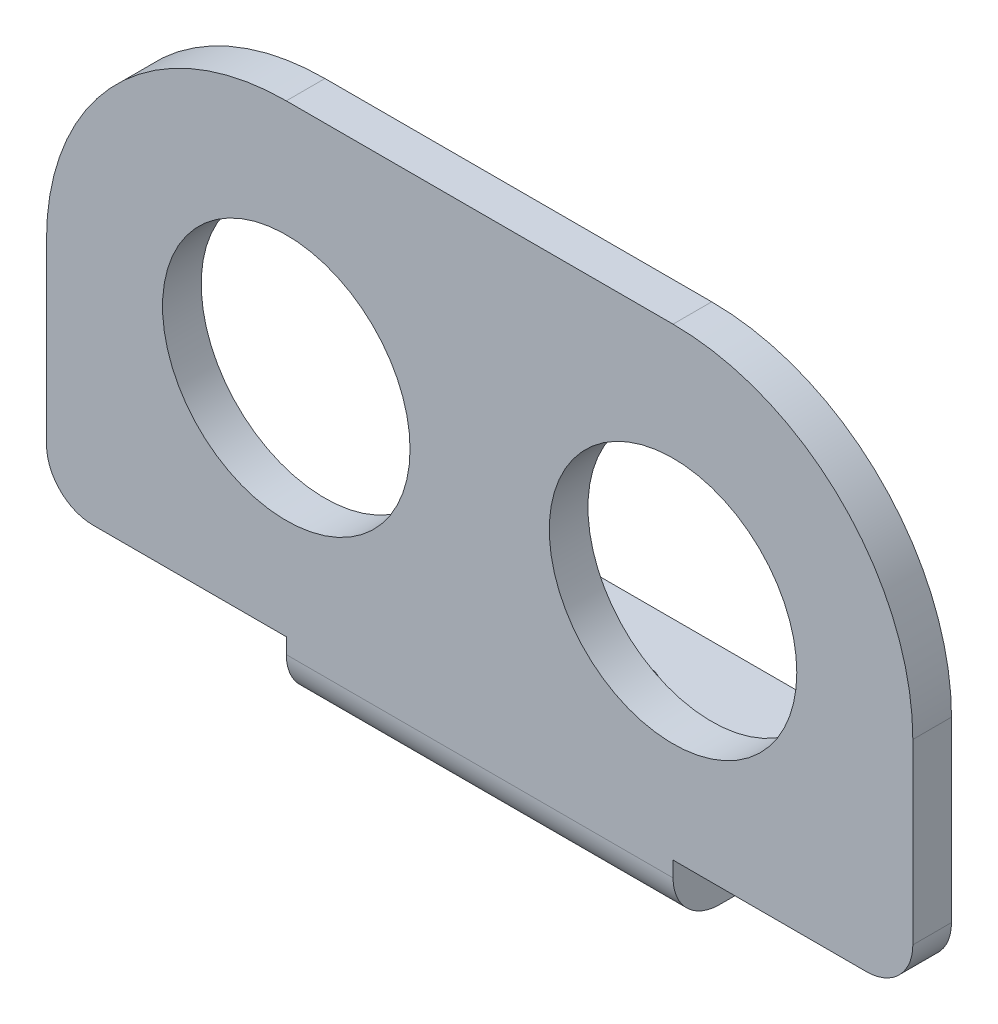
ISO-10303-21;
HEADER;
FILE_DESCRIPTION(('STEP AP214'),'2;1');
FILE_NAME('part.step','',(''),(''),'','','');
FILE_SCHEMA(('AUTOMOTIVE_DESIGN { 1 0 10303 214 1 1 1 1 }'));
ENDSEC;
DATA;
#1=APPLICATION_CONTEXT('core data for automotive mechanical design processes');
#2=APPLICATION_PROTOCOL_DEFINITION('international standard','automotive_design',2000,#1);
#3=PRODUCT_CONTEXT('',#1,'mechanical');
#4=PRODUCT('Part','Part','',(#3));
#5=PRODUCT_RELATED_PRODUCT_CATEGORY('part','',(#4));
#6=PRODUCT_DEFINITION_FORMATION('','',#4);
#7=PRODUCT_DEFINITION_CONTEXT('part definition',#1,'design');
#8=PRODUCT_DEFINITION('design','',#6,#7);
#9=PRODUCT_DEFINITION_SHAPE('','',#8);
#10=(LENGTH_UNIT() NAMED_UNIT(*) SI_UNIT(.MILLI.,.METRE.));
#11=(NAMED_UNIT(*) PLANE_ANGLE_UNIT() SI_UNIT($,.RADIAN.));
#12=(NAMED_UNIT(*) SI_UNIT($,.STERADIAN.) SOLID_ANGLE_UNIT());
#13=UNCERTAINTY_MEASURE_WITH_UNIT(LENGTH_MEASURE(1.E-05),#10,'distance_accuracy_value','');
#14=(GEOMETRIC_REPRESENTATION_CONTEXT(3) GLOBAL_UNCERTAINTY_ASSIGNED_CONTEXT((#13)) GLOBAL_UNIT_ASSIGNED_CONTEXT((#10,
#11,#12)) REPRESENTATION_CONTEXT('',''));
#15=CARTESIAN_POINT('',(0.,0.,0.));
#16=DIRECTION('',(0.,0.,1.));
#17=DIRECTION('',(1.,0.,0.));
#18=AXIS2_PLACEMENT_3D('',#15,#16,#17);
#19=CARTESIAN_POINT('',(12.5,-0.5,2.5));
#20=DIRECTION('',(0.,0.,-1.));
#21=DIRECTION('',(-1.,0.,0.));
#22=AXIS2_PLACEMENT_3D('',#19,#20,#21);
#23=PLANE('',#22);
#24=DIRECTION('',(0.,-1.,0.));
#25=VECTOR('',#24,1.);
#26=CARTESIAN_POINT('',(-12.5,-15.,2.5));
#27=LINE('',#26,#25);
#28=CARTESIAN_POINT('',(-12.5,-15.,2.5));
#29=VERTEX_POINT('',#28);
#30=CARTESIAN_POINT('',(-12.5,-16.,2.5));
#31=VERTEX_POINT('',#30);
#32=EDGE_CURVE('E217',#29,#31,#27,.T.);
#33=ORIENTED_EDGE('',*,*,#32,.T.);
#34=DIRECTION('',(1.,0.,0.));
#35=VECTOR('',#34,1.);
#36=CARTESIAN_POINT('',(12.5,-16.,2.5));
#37=LINE('',#36,#35);
#38=CARTESIAN_POINT('',(12.5,-16.,2.5));
#39=VERTEX_POINT('',#38);
#40=EDGE_CURVE('E295',#31,#39,#37,.T.);
#41=ORIENTED_EDGE('',*,*,#40,.T.);
#42=DIRECTION('',(0.,1.,0.));
#43=VECTOR('',#42,1.);
#44=CARTESIAN_POINT('',(12.5,-15.,2.5));
#45=LINE('',#44,#43);
#46=CARTESIAN_POINT('',(12.5,-15.,2.5));
#47=VERTEX_POINT('',#46);
#48=EDGE_CURVE('E220',#39,#47,#45,.T.);
#49=ORIENTED_EDGE('',*,*,#48,.T.);
#50=DIRECTION('',(1.,0.,0.));
#51=VECTOR('',#50,1.);
#52=CARTESIAN_POINT('',(12.5,-15.,2.5));
#53=LINE('',#52,#51);
#54=CARTESIAN_POINT('',(25.,-15.,2.5));
#55=VERTEX_POINT('',#54);
#56=EDGE_CURVE('E173',#47,#55,#53,.T.);
#57=ORIENTED_EDGE('',*,*,#56,.T.);
#58=CARTESIAN_POINT('',(25.,-12.,2.5));
#59=DIRECTION('',(0.,0.,-1.));
#60=DIRECTION('',(-1.,0.,0.));
#61=AXIS2_PLACEMENT_3D('',#58,#59,#60);
#62=CIRCLE('',#61,3.);
#63=CARTESIAN_POINT('',(28.,-12.,2.5));
#64=VERTEX_POINT('',#63);
#65=EDGE_CURVE('E267',#55,#64,#62,.F.);
#66=ORIENTED_EDGE('',*,*,#65,.T.);
#67=DIRECTION('',(0.,1.,0.));
#68=VECTOR('',#67,1.);
#69=CARTESIAN_POINT('',(28.,-0.5,2.5));
#70=LINE('',#69,#68);
#71=CARTESIAN_POINT('',(28.,-0.5,2.5));
#72=VERTEX_POINT('',#71);
#73=EDGE_CURVE('E204',#64,#72,#70,.T.);
#74=ORIENTED_EDGE('',*,*,#73,.T.);
#75=CARTESIAN_POINT('',(12.5,-0.5,2.5));
#76=DIRECTION('',(0.,0.,1.));
#77=DIRECTION('',(-1.,0.,0.));
#78=AXIS2_PLACEMENT_3D('',#75,#76,#77);
#79=CIRCLE('',#78,15.5);
#80=CARTESIAN_POINT('',(12.5,15.,2.5));
#81=VERTEX_POINT('',#80);
#82=EDGE_CURVE('E206',#72,#81,#79,.T.);
#83=ORIENTED_EDGE('',*,*,#82,.T.);
#84=DIRECTION('',(-1.,0.,0.));
#85=VECTOR('',#84,1.);
#86=CARTESIAN_POINT('',(12.5,15.,2.5));
#87=LINE('',#86,#85);
#88=CARTESIAN_POINT('',(-12.5,15.,2.5));
#89=VERTEX_POINT('',#88);
#90=EDGE_CURVE('E208',#81,#89,#87,.T.);
#91=ORIENTED_EDGE('',*,*,#90,.T.);
#92=CARTESIAN_POINT('',(-12.5,-0.5,2.5));
#93=DIRECTION('',(0.,0.,1.));
#94=DIRECTION('',(1.,0.,0.));
#95=AXIS2_PLACEMENT_3D('',#92,#93,#94);
#96=CIRCLE('',#95,15.5);
#97=CARTESIAN_POINT('',(-28.,-0.499999999999998,2.5));
#98=VERTEX_POINT('',#97);
#99=EDGE_CURVE('E210',#89,#98,#96,.T.);
#100=ORIENTED_EDGE('',*,*,#99,.T.);
#101=DIRECTION('',(0.,-1.,0.));
#102=VECTOR('',#101,1.);
#103=CARTESIAN_POINT('',(-28.,-15.,2.5));
#104=LINE('',#103,#102);
#105=CARTESIAN_POINT('',(-28.,-12.,2.5));
#106=VERTEX_POINT('',#105);
#107=EDGE_CURVE('E212',#98,#106,#104,.T.);
#108=ORIENTED_EDGE('',*,*,#107,.T.);
#109=CARTESIAN_POINT('',(-25.,-12.,2.5));
#110=DIRECTION('',(0.,0.,-1.));
#111=DIRECTION('',(-1.,0.,0.));
#112=AXIS2_PLACEMENT_3D('',#109,#110,#111);
#113=CIRCLE('',#112,3.);
#114=CARTESIAN_POINT('',(-25.,-15.,2.5));
#115=VERTEX_POINT('',#114);
#116=EDGE_CURVE('E269',#106,#115,#113,.F.);
#117=ORIENTED_EDGE('',*,*,#116,.T.);
#118=DIRECTION('',(1.,0.,0.));
#119=VECTOR('',#118,1.);
#120=CARTESIAN_POINT('',(-28.,-15.,2.5));
#121=LINE('',#120,#119);
#122=EDGE_CURVE('E215',#115,#29,#121,.T.);
#123=ORIENTED_EDGE('',*,*,#122,.T.);
#124=EDGE_LOOP('',(#33,#41,#49,#57,#66,#74,#83,#91,#100,#108,#117,#123));
#125=FACE_BOUND('',#124,.T.);
#126=CARTESIAN_POINT('',(12.5,-0.5,2.5));
#127=DIRECTION('',(0.,0.,1.));
#128=DIRECTION('',(1.,0.,0.));
#129=AXIS2_PLACEMENT_3D('',#126,#127,#128);
#130=CIRCLE('',#129,8.);
#131=CARTESIAN_POINT('',(20.5,-0.5,2.5));
#132=VERTEX_POINT('',#131);
#133=EDGE_CURVE('E197',#132,#132,#130,.T.);
#134=ORIENTED_EDGE('',*,*,#133,.F.);
#135=EDGE_LOOP('',(#134));
#136=FACE_BOUND('',#135,.T.);
#137=CARTESIAN_POINT('',(-12.5,-0.5,2.5));
#138=DIRECTION('',(0.,0.,1.));
#139=DIRECTION('',(1.,0.,0.));
#140=AXIS2_PLACEMENT_3D('',#137,#138,#139);
#141=CIRCLE('',#140,8.);
#142=CARTESIAN_POINT('',(-4.5,-0.5,2.5));
#143=VERTEX_POINT('',#142);
#144=EDGE_CURVE('E191',#143,#143,#141,.T.);
#145=ORIENTED_EDGE('',*,*,#144,.F.);
#146=EDGE_LOOP('',(#145));
#147=FACE_BOUND('',#146,.T.);
#148=ADVANCED_FACE('F34',(#125,#136,#147),#23,.F.);
#149=CARTESIAN_POINT('',(12.5,-0.5,0.));
#150=DIRECTION('',(0.,0.,-1.));
#151=DIRECTION('',(-1.,0.,0.));
#152=AXIS2_PLACEMENT_3D('',#149,#150,#151);
#153=PLANE('',#152);
#154=DIRECTION('',(1.,0.,0.));
#155=VECTOR('',#154,1.);
#156=CARTESIAN_POINT('',(12.5,-16.,0.));
#157=LINE('',#156,#155);
#158=CARTESIAN_POINT('',(-12.5,-16.,0.));
#159=VERTEX_POINT('',#158);
#160=CARTESIAN_POINT('',(12.5,-16.,0.));
#161=VERTEX_POINT('',#160);
#162=EDGE_CURVE('E169',#159,#161,#157,.T.);
#163=ORIENTED_EDGE('',*,*,#162,.F.);
#164=DIRECTION('',(0.,-1.,0.));
#165=VECTOR('',#164,1.);
#166=CARTESIAN_POINT('',(-12.5,-15.,0.));
#167=LINE('',#166,#165);
#168=CARTESIAN_POINT('',(-12.5,-15.,0.));
#169=VERTEX_POINT('',#168);
#170=EDGE_CURVE('E174',#169,#159,#167,.T.);
#171=ORIENTED_EDGE('',*,*,#170,.F.);
#172=DIRECTION('',(1.,0.,0.));
#173=VECTOR('',#172,1.);
#174=CARTESIAN_POINT('',(-28.,-15.,0.));
#175=LINE('',#174,#173);
#176=CARTESIAN_POINT('',(-25.,-15.,0.));
#177=VERTEX_POINT('',#176);
#178=EDGE_CURVE('E235',#177,#169,#175,.T.);
#179=ORIENTED_EDGE('',*,*,#178,.F.);
#180=CARTESIAN_POINT('',(-25.,-12.,0.));
#181=DIRECTION('',(0.,0.,-1.));
#182=DIRECTION('',(-1.,0.,0.));
#183=AXIS2_PLACEMENT_3D('',#180,#181,#182);
#184=CIRCLE('',#183,3.);
#185=CARTESIAN_POINT('',(-28.,-12.,0.));
#186=VERTEX_POINT('',#185);
#187=EDGE_CURVE('E263',#177,#186,#184,.T.);
#188=ORIENTED_EDGE('',*,*,#187,.T.);
#189=DIRECTION('',(0.,-1.,0.));
#190=VECTOR('',#189,1.);
#191=CARTESIAN_POINT('',(-28.,-15.,0.));
#192=LINE('',#191,#190);
#193=CARTESIAN_POINT('',(-28.,-0.499999999999998,0.));
#194=VERTEX_POINT('',#193);
#195=EDGE_CURVE('E232',#194,#186,#192,.T.);
#196=ORIENTED_EDGE('',*,*,#195,.F.);
#197=CARTESIAN_POINT('',(-12.5,-0.5,0.));
#198=DIRECTION('',(0.,0.,1.));
#199=DIRECTION('',(1.,0.,0.));
#200=AXIS2_PLACEMENT_3D('',#197,#198,#199);
#201=CIRCLE('',#200,15.5);
#202=CARTESIAN_POINT('',(-12.5,15.,0.));
#203=VERTEX_POINT('',#202);
#204=EDGE_CURVE('E230',#203,#194,#201,.T.);
#205=ORIENTED_EDGE('',*,*,#204,.F.);
#206=DIRECTION('',(-1.,0.,0.));
#207=VECTOR('',#206,1.);
#208=CARTESIAN_POINT('',(12.5,15.,0.));
#209=LINE('',#208,#207);
#210=CARTESIAN_POINT('',(12.5,15.,0.));
#211=VERTEX_POINT('',#210);
#212=EDGE_CURVE('E228',#211,#203,#209,.T.);
#213=ORIENTED_EDGE('',*,*,#212,.F.);
#214=CARTESIAN_POINT('',(12.5,-0.5,0.));
#215=DIRECTION('',(0.,0.,1.));
#216=DIRECTION('',(-1.,0.,0.));
#217=AXIS2_PLACEMENT_3D('',#214,#215,#216);
#218=CIRCLE('',#217,15.5);
#219=CARTESIAN_POINT('',(28.,-0.5,0.));
#220=VERTEX_POINT('',#219);
#221=EDGE_CURVE('E226',#220,#211,#218,.T.);
#222=ORIENTED_EDGE('',*,*,#221,.F.);
#223=DIRECTION('',(0.,1.,0.));
#224=VECTOR('',#223,1.);
#225=CARTESIAN_POINT('',(28.,-0.5,0.));
#226=LINE('',#225,#224);
#227=CARTESIAN_POINT('',(28.,-12.,0.));
#228=VERTEX_POINT('',#227);
#229=EDGE_CURVE('E224',#228,#220,#226,.T.);
#230=ORIENTED_EDGE('',*,*,#229,.F.);
#231=CARTESIAN_POINT('',(25.,-12.,0.));
#232=DIRECTION('',(0.,0.,-1.));
#233=DIRECTION('',(-1.,0.,0.));
#234=AXIS2_PLACEMENT_3D('',#231,#232,#233);
#235=CIRCLE('',#234,3.);
#236=CARTESIAN_POINT('',(25.,-15.,0.));
#237=VERTEX_POINT('',#236);
#238=EDGE_CURVE('E261',#228,#237,#235,.T.);
#239=ORIENTED_EDGE('',*,*,#238,.T.);
#240=DIRECTION('',(1.,0.,0.));
#241=VECTOR('',#240,1.);
#242=CARTESIAN_POINT('',(12.5,-15.,0.));
#243=LINE('',#242,#241);
#244=CARTESIAN_POINT('',(12.5,-15.,0.));
#245=VERTEX_POINT('',#244);
#246=EDGE_CURVE('E172',#245,#237,#243,.T.);
#247=ORIENTED_EDGE('',*,*,#246,.F.);
#248=DIRECTION('',(0.,1.,0.));
#249=VECTOR('',#248,1.);
#250=CARTESIAN_POINT('',(12.5,-15.,0.));
#251=LINE('',#250,#249);
#252=EDGE_CURVE('E153',#161,#245,#251,.T.);
#253=ORIENTED_EDGE('',*,*,#252,.F.);
#254=EDGE_LOOP('',(#163,#171,#179,#188,#196,#205,#213,#222,#230,#239,#247,#253));
#255=FACE_BOUND('',#254,.T.);
#256=CARTESIAN_POINT('',(12.5,-0.5,0.));
#257=DIRECTION('',(0.,0.,1.));
#258=DIRECTION('',(1.,0.,0.));
#259=AXIS2_PLACEMENT_3D('',#256,#257,#258);
#260=CIRCLE('',#259,8.);
#261=CARTESIAN_POINT('',(20.5,-0.5,0.));
#262=VERTEX_POINT('',#261);
#263=EDGE_CURVE('E194',#262,#262,#260,.T.);
#264=ORIENTED_EDGE('',*,*,#263,.T.);
#265=EDGE_LOOP('',(#264));
#266=FACE_BOUND('',#265,.T.);
#267=CARTESIAN_POINT('',(-12.5,-0.5,0.));
#268=DIRECTION('',(0.,0.,1.));
#269=DIRECTION('',(1.,0.,0.));
#270=AXIS2_PLACEMENT_3D('',#267,#268,#269);
#271=CIRCLE('',#270,8.);
#272=CARTESIAN_POINT('',(-4.5,-0.5,0.));
#273=VERTEX_POINT('',#272);
#274=EDGE_CURVE('E190',#273,#273,#271,.T.);
#275=ORIENTED_EDGE('',*,*,#274,.T.);
#276=EDGE_LOOP('',(#275));
#277=FACE_BOUND('',#276,.T.);
#278=ADVANCED_FACE('F166',(#255,#266,#277),#153,.T.);
#279=CARTESIAN_POINT('',(12.5,-15.,2.5));
#280=DIRECTION('',(0.,1.,0.));
#281=DIRECTION('',(-1.,0.,0.));
#282=AXIS2_PLACEMENT_3D('',#279,#280,#281);
#283=PLANE('',#282);
#284=ORIENTED_EDGE('',*,*,#246,.T.);
#285=DIRECTION('',(0.,0.,-1.));
#286=VECTOR('',#285,1.);
#287=CARTESIAN_POINT('',(25.,-15.,2.5));
#288=LINE('',#287,#286);
#289=EDGE_CURVE('E274',#237,#55,#288,.F.);
#290=ORIENTED_EDGE('',*,*,#289,.T.);
#291=ORIENTED_EDGE('',*,*,#56,.F.);
#292=DIRECTION('',(0.,0.,-1.));
#293=VECTOR('',#292,1.);
#294=CARTESIAN_POINT('',(12.5,-15.,2.5));
#295=LINE('',#294,#293);
#296=EDGE_CURVE('E222',#47,#245,#295,.T.);
#297=ORIENTED_EDGE('',*,*,#296,.T.);
#298=EDGE_LOOP('',(#284,#290,#291,#297));
#299=FACE_BOUND('',#298,.T.);
#300=ADVANCED_FACE('F306',(#299),#283,.F.);
#301=CARTESIAN_POINT('',(28.,-0.5,2.5));
#302=DIRECTION('',(-1.,0.,0.));
#303=DIRECTION('',(0.,-1.,0.));
#304=AXIS2_PLACEMENT_3D('',#301,#302,#303);
#305=PLANE('',#304);
#306=ORIENTED_EDGE('',*,*,#73,.F.);
#307=DIRECTION('',(0.,0.,-1.));
#308=VECTOR('',#307,1.);
#309=CARTESIAN_POINT('',(28.,-12.,2.5));
#310=LINE('',#309,#308);
#311=EDGE_CURVE('E271',#64,#228,#310,.T.);
#312=ORIENTED_EDGE('',*,*,#311,.T.);
#313=ORIENTED_EDGE('',*,*,#229,.T.);
#314=DIRECTION('',(0.,0.,-1.));
#315=VECTOR('',#314,1.);
#316=CARTESIAN_POINT('',(28.,-0.5,2.5));
#317=LINE('',#316,#315);
#318=EDGE_CURVE('E255',#72,#220,#317,.T.);
#319=ORIENTED_EDGE('',*,*,#318,.F.);
#320=EDGE_LOOP('',(#306,#312,#313,#319));
#321=FACE_BOUND('',#320,.T.);
#322=ADVANCED_FACE('F315',(#321),#305,.F.);
#323=CARTESIAN_POINT('',(12.5,-0.5,2.5));
#324=DIRECTION('',(0.,0.,-1.));
#325=DIRECTION('',(-1.,0.,0.));
#326=AXIS2_PLACEMENT_3D('',#323,#324,#325);
#327=CYLINDRICAL_SURFACE('',#326,15.5);
#328=ORIENTED_EDGE('',*,*,#221,.T.);
#329=DIRECTION('',(0.,0.,-1.));
#330=VECTOR('',#329,1.);
#331=CARTESIAN_POINT('',(12.5,15.,2.5));
#332=LINE('',#331,#330);
#333=EDGE_CURVE('E252',#81,#211,#332,.T.);
#334=ORIENTED_EDGE('',*,*,#333,.F.);
#335=ORIENTED_EDGE('',*,*,#82,.F.);
#336=ORIENTED_EDGE('',*,*,#318,.T.);
#337=EDGE_LOOP('',(#328,#334,#335,#336));
#338=FACE_BOUND('',#337,.T.);
#339=ADVANCED_FACE('F322',(#338),#327,.T.);
#340=CARTESIAN_POINT('',(12.5,15.,2.5));
#341=DIRECTION('',(0.,-1.,0.));
#342=DIRECTION('',(1.,0.,0.));
#343=AXIS2_PLACEMENT_3D('',#340,#341,#342);
#344=PLANE('',#343);
#345=ORIENTED_EDGE('',*,*,#212,.T.);
#346=DIRECTION('',(0.,0.,-1.));
#347=VECTOR('',#346,1.);
#348=CARTESIAN_POINT('',(-12.5,15.,2.5));
#349=LINE('',#348,#347);
#350=EDGE_CURVE('E249',#89,#203,#349,.T.);
#351=ORIENTED_EDGE('',*,*,#350,.F.);
#352=ORIENTED_EDGE('',*,*,#90,.F.);
#353=ORIENTED_EDGE('',*,*,#333,.T.);
#354=EDGE_LOOP('',(#345,#351,#352,#353));
#355=FACE_BOUND('',#354,.T.);
#356=ADVANCED_FACE('F326',(#355),#344,.F.);
#357=CARTESIAN_POINT('',(-12.5,-0.5,2.5));
#358=DIRECTION('',(0.,0.,-1.));
#359=DIRECTION('',(-1.,0.,0.));
#360=AXIS2_PLACEMENT_3D('',#357,#358,#359);
#361=CYLINDRICAL_SURFACE('',#360,15.5);
#362=ORIENTED_EDGE('',*,*,#204,.T.);
#363=DIRECTION('',(0.,0.,-1.));
#364=VECTOR('',#363,1.);
#365=CARTESIAN_POINT('',(-28.,-0.499999999999998,2.5));
#366=LINE('',#365,#364);
#367=EDGE_CURVE('E246',#98,#194,#366,.T.);
#368=ORIENTED_EDGE('',*,*,#367,.F.);
#369=ORIENTED_EDGE('',*,*,#99,.F.);
#370=ORIENTED_EDGE('',*,*,#350,.T.);
#371=EDGE_LOOP('',(#362,#368,#369,#370));
#372=FACE_BOUND('',#371,.T.);
#373=ADVANCED_FACE('F333',(#372),#361,.T.);
#374=CARTESIAN_POINT('',(-28.,-15.,2.5));
#375=DIRECTION('',(1.,0.,0.));
#376=DIRECTION('',(0.,0.,-1.));
#377=AXIS2_PLACEMENT_3D('',#374,#375,#376);
#378=PLANE('',#377);
#379=ORIENTED_EDGE('',*,*,#195,.T.);
#380=DIRECTION('',(0.,0.,-1.));
#381=VECTOR('',#380,1.);
#382=CARTESIAN_POINT('',(-28.,-12.,2.5));
#383=LINE('',#382,#381);
#384=EDGE_CURVE('E265',#186,#106,#383,.F.);
#385=ORIENTED_EDGE('',*,*,#384,.T.);
#386=ORIENTED_EDGE('',*,*,#107,.F.);
#387=ORIENTED_EDGE('',*,*,#367,.T.);
#388=EDGE_LOOP('',(#379,#385,#386,#387));
#389=FACE_BOUND('',#388,.T.);
#390=ADVANCED_FACE('F336',(#389),#378,.F.);
#391=CARTESIAN_POINT('',(-28.,-15.,2.5));
#392=DIRECTION('',(0.,1.,0.));
#393=DIRECTION('',(-1.,0.,0.));
#394=AXIS2_PLACEMENT_3D('',#391,#392,#393);
#395=PLANE('',#394);
#396=ORIENTED_EDGE('',*,*,#122,.F.);
#397=DIRECTION('',(0.,0.,-1.));
#398=VECTOR('',#397,1.);
#399=CARTESIAN_POINT('',(-25.,-15.,2.5));
#400=LINE('',#399,#398);
#401=EDGE_CURVE('E258',#115,#177,#400,.T.);
#402=ORIENTED_EDGE('',*,*,#401,.T.);
#403=ORIENTED_EDGE('',*,*,#178,.T.);
#404=DIRECTION('',(0.,0.,-1.));
#405=VECTOR('',#404,1.);
#406=CARTESIAN_POINT('',(-12.5,-15.,2.5));
#407=LINE('',#406,#405);
#408=EDGE_CURVE('E243',#29,#169,#407,.T.);
#409=ORIENTED_EDGE('',*,*,#408,.F.);
#410=EDGE_LOOP('',(#396,#402,#403,#409));
#411=FACE_BOUND('',#410,.T.);
#412=ADVANCED_FACE('F344',(#411),#395,.F.);
#413=CARTESIAN_POINT('',(-12.5,-15.,2.5));
#414=DIRECTION('',(1.,0.,0.));
#415=DIRECTION('',(0.,0.,-1.));
#416=AXIS2_PLACEMENT_3D('',#413,#414,#415);
#417=PLANE('',#416);
#418=DIRECTION('',(0.,0.,-1.));
#419=VECTOR('',#418,1.);
#420=CARTESIAN_POINT('',(-12.5,-19.,2.5));
#421=LINE('',#420,#419);
#422=CARTESIAN_POINT('',(-12.5,-19.,-0.5));
#423=VERTEX_POINT('',#422);
#424=CARTESIAN_POINT('',(-12.5,-19.,-9.5));
#425=VERTEX_POINT('',#424);
#426=EDGE_CURVE('E241',#423,#425,#421,.T.);
#427=ORIENTED_EDGE('',*,*,#426,.F.);
#428=CARTESIAN_POINT('',(-12.5,-16.,-0.5));
#429=DIRECTION('',(1.,0.,0.));
#430=DIRECTION('',(0.,0.,-1.));
#431=AXIS2_PLACEMENT_3D('',#428,#429,#430);
#432=CIRCLE('',#431,3.);
#433=EDGE_CURVE('E11',#423,#31,#432,.F.);
#434=ORIENTED_EDGE('',*,*,#433,.T.);
#435=ORIENTED_EDGE('',*,*,#32,.F.);
#436=ORIENTED_EDGE('',*,*,#408,.T.);
#437=ORIENTED_EDGE('',*,*,#170,.T.);
#438=DIRECTION('',(0.,0.,1.));
#439=VECTOR('',#438,1.);
#440=CARTESIAN_POINT('',(-12.5,-16.,-12.));
#441=LINE('',#440,#439);
#442=CARTESIAN_POINT('',(-12.5,-16.,-9.5));
#443=VERTEX_POINT('',#442);
#444=EDGE_CURVE('E160',#443,#159,#441,.T.);
#445=ORIENTED_EDGE('',*,*,#444,.F.);
#446=DIRECTION('',(0.,1.,0.));
#447=VECTOR('',#446,1.);
#448=CARTESIAN_POINT('',(-12.5,-15.,-9.5));
#449=LINE('',#448,#447);
#450=EDGE_CURVE('E286',#443,#425,#449,.F.);
#451=ORIENTED_EDGE('',*,*,#450,.T.);
#452=EDGE_LOOP('',(#427,#434,#435,#436,#437,#445,#451));
#453=FACE_BOUND('',#452,.T.);
#454=ADVANCED_FACE('F347',(#453),#417,.F.);
#455=CARTESIAN_POINT('',(-12.5,-19.,2.5));
#456=DIRECTION('',(0.,1.,0.));
#457=DIRECTION('',(0.,0.,1.));
#458=AXIS2_PLACEMENT_3D('',#455,#456,#457);
#459=PLANE('',#458);
#460=CARTESIAN_POINT('',(0.,-19.,-7.));
#461=DIRECTION('',(0.,1.,0.));
#462=DIRECTION('',(0.,0.,1.));
#463=AXIS2_PLACEMENT_3D('',#460,#461,#462);
#464=CIRCLE('',#463,1.5);
#465=CARTESIAN_POINT('',(0.,-19.,-5.5));
#466=VERTEX_POINT('',#465);
#467=EDGE_CURVE('E180',#466,#466,#464,.T.);
#468=ORIENTED_EDGE('',*,*,#467,.T.);
#469=EDGE_LOOP('',(#468));
#470=FACE_BOUND('',#469,.T.);
#471=DIRECTION('',(0.,0.,-1.));
#472=VECTOR('',#471,1.);
#473=CARTESIAN_POINT('',(12.5,-19.,2.5));
#474=LINE('',#473,#472);
#475=CARTESIAN_POINT('',(12.5,-19.,-0.5));
#476=VERTEX_POINT('',#475);
#477=CARTESIAN_POINT('',(12.5,-19.,-9.5));
#478=VERTEX_POINT('',#477);
#479=EDGE_CURVE('E239',#476,#478,#474,.T.);
#480=ORIENTED_EDGE('',*,*,#479,.F.);
#481=DIRECTION('',(1.,0.,0.));
#482=VECTOR('',#481,1.);
#483=CARTESIAN_POINT('',(-12.5,-19.,-0.5));
#484=LINE('',#483,#482);
#485=EDGE_CURVE('E42',#476,#423,#484,.F.);
#486=ORIENTED_EDGE('',*,*,#485,.T.);
#487=ORIENTED_EDGE('',*,*,#426,.T.);
#488=CARTESIAN_POINT('',(-10.,-19.,-9.5));
#489=DIRECTION('',(0.,1.,0.));
#490=DIRECTION('',(0.,0.,1.));
#491=AXIS2_PLACEMENT_3D('',#488,#489,#490);
#492=CIRCLE('',#491,2.5);
#493=CARTESIAN_POINT('',(-10.,-19.,-12.));
#494=VERTEX_POINT('',#493);
#495=EDGE_CURVE('E292',#425,#494,#492,.F.);
#496=ORIENTED_EDGE('',*,*,#495,.T.);
#497=DIRECTION('',(-1.,0.,0.));
#498=VECTOR('',#497,1.);
#499=CARTESIAN_POINT('',(12.5,-19.,-12.));
#500=LINE('',#499,#498);
#501=CARTESIAN_POINT('',(10.,-19.,-12.));
#502=VERTEX_POINT('',#501);
#503=EDGE_CURVE('E179',#502,#494,#500,.T.);
#504=ORIENTED_EDGE('',*,*,#503,.F.);
#505=CARTESIAN_POINT('',(10.,-19.,-9.5));
#506=DIRECTION('',(0.,1.,0.));
#507=DIRECTION('',(0.,0.,1.));
#508=AXIS2_PLACEMENT_3D('',#505,#506,#507);
#509=CIRCLE('',#508,2.5);
#510=EDGE_CURVE('E289',#502,#478,#509,.F.);
#511=ORIENTED_EDGE('',*,*,#510,.T.);
#512=EDGE_LOOP('',(#480,#486,#487,#496,#504,#511));
#513=FACE_BOUND('',#512,.T.);
#514=ADVANCED_FACE('F371',(#470,#513),#459,.F.);
#515=CARTESIAN_POINT('',(12.5,-15.,2.5));
#516=DIRECTION('',(-1.,0.,0.));
#517=DIRECTION('',(0.,0.,1.));
#518=AXIS2_PLACEMENT_3D('',#515,#516,#517);
#519=PLANE('',#518);
#520=ORIENTED_EDGE('',*,*,#48,.F.);
#521=CARTESIAN_POINT('',(12.5,-16.,-0.5));
#522=DIRECTION('',(-1.,0.,0.));
#523=DIRECTION('',(0.,0.,1.));
#524=AXIS2_PLACEMENT_3D('',#521,#522,#523);
#525=CIRCLE('',#524,3.);
#526=EDGE_CURVE('E56',#39,#476,#525,.F.);
#527=ORIENTED_EDGE('',*,*,#526,.T.);
#528=ORIENTED_EDGE('',*,*,#479,.T.);
#529=DIRECTION('',(0.,-1.,0.));
#530=VECTOR('',#529,1.);
#531=CARTESIAN_POINT('',(12.5,-15.,-9.5));
#532=LINE('',#531,#530);
#533=CARTESIAN_POINT('',(12.5,-16.,-9.5));
#534=VERTEX_POINT('',#533);
#535=EDGE_CURVE('E156',#478,#534,#532,.F.);
#536=ORIENTED_EDGE('',*,*,#535,.T.);
#537=DIRECTION('',(0.,0.,1.));
#538=VECTOR('',#537,1.);
#539=CARTESIAN_POINT('',(12.5,-16.,-12.));
#540=LINE('',#539,#538);
#541=EDGE_CURVE('E149',#534,#161,#540,.T.);
#542=ORIENTED_EDGE('',*,*,#541,.T.);
#543=ORIENTED_EDGE('',*,*,#252,.T.);
#544=ORIENTED_EDGE('',*,*,#296,.F.);
#545=EDGE_LOOP('',(#520,#527,#528,#536,#542,#543,#544));
#546=FACE_BOUND('',#545,.T.);
#547=ADVANCED_FACE('F151',(#546),#519,.F.);
#548=CARTESIAN_POINT('',(12.5,-0.5,2.5));
#549=DIRECTION('',(0.,0.,-1.));
#550=DIRECTION('',(-1.,0.,0.));
#551=AXIS2_PLACEMENT_3D('',#548,#549,#550);
#552=CYLINDRICAL_SURFACE('',#551,8.);
#553=ORIENTED_EDGE('',*,*,#133,.T.);
#554=EDGE_LOOP('',(#553));
#555=FACE_BOUND('',#554,.T.);
#556=ORIENTED_EDGE('',*,*,#263,.F.);
#557=EDGE_LOOP('',(#556));
#558=FACE_BOUND('',#557,.T.);
#559=ADVANCED_FACE('F366',(#555,#558),#552,.F.);
#560=CARTESIAN_POINT('',(-12.5,-0.5,2.5));
#561=DIRECTION('',(0.,0.,-1.));
#562=DIRECTION('',(-1.,0.,0.));
#563=AXIS2_PLACEMENT_3D('',#560,#561,#562);
#564=CYLINDRICAL_SURFACE('',#563,8.);
#565=ORIENTED_EDGE('',*,*,#144,.T.);
#566=EDGE_LOOP('',(#565));
#567=FACE_BOUND('',#566,.T.);
#568=ORIENTED_EDGE('',*,*,#274,.F.);
#569=EDGE_LOOP('',(#568));
#570=FACE_BOUND('',#569,.T.);
#571=ADVANCED_FACE('F393',(#567,#570),#564,.F.);
#572=CARTESIAN_POINT('',(-25.,-12.,2.5));
#573=DIRECTION('',(0.,0.,-1.));
#574=DIRECTION('',(-1.,0.,0.));
#575=AXIS2_PLACEMENT_3D('',#572,#573,#574);
#576=CYLINDRICAL_SURFACE('',#575,3.);
#577=ORIENTED_EDGE('',*,*,#116,.F.);
#578=ORIENTED_EDGE('',*,*,#384,.F.);
#579=ORIENTED_EDGE('',*,*,#187,.F.);
#580=ORIENTED_EDGE('',*,*,#401,.F.);
#581=EDGE_LOOP('',(#577,#578,#579,#580));
#582=FACE_BOUND('',#581,.T.);
#583=ADVANCED_FACE('F339',(#582),#576,.T.);
#584=CARTESIAN_POINT('',(25.,-12.,2.5));
#585=DIRECTION('',(0.,0.,-1.));
#586=DIRECTION('',(-1.,0.,0.));
#587=AXIS2_PLACEMENT_3D('',#584,#585,#586);
#588=CYLINDRICAL_SURFACE('',#587,3.);
#589=ORIENTED_EDGE('',*,*,#65,.F.);
#590=ORIENTED_EDGE('',*,*,#289,.F.);
#591=ORIENTED_EDGE('',*,*,#238,.F.);
#592=ORIENTED_EDGE('',*,*,#311,.F.);
#593=EDGE_LOOP('',(#589,#590,#591,#592));
#594=FACE_BOUND('',#593,.T.);
#595=ADVANCED_FACE('F312',(#594),#588,.T.);
#596=CARTESIAN_POINT('',(12.5,-16.,-12.));
#597=DIRECTION('',(0.,-1.,0.));
#598=DIRECTION('',(0.,0.,-1.));
#599=AXIS2_PLACEMENT_3D('',#596,#597,#598);
#600=PLANE('',#599);
#601=CARTESIAN_POINT('',(0.,-16.,-7.));
#602=DIRECTION('',(0.,1.,0.));
#603=DIRECTION('',(0.,0.,1.));
#604=AXIS2_PLACEMENT_3D('',#601,#602,#603);
#605=CIRCLE('',#604,1.5);
#606=CARTESIAN_POINT('',(0.,-16.,-5.5));
#607=VERTEX_POINT('',#606);
#608=EDGE_CURVE('E185',#607,#607,#605,.T.);
#609=ORIENTED_EDGE('',*,*,#608,.F.);
#610=EDGE_LOOP('',(#609));
#611=FACE_BOUND('',#610,.T.);
#612=DIRECTION('',(1.,0.,0.));
#613=VECTOR('',#612,1.);
#614=CARTESIAN_POINT('',(12.5,-16.,-12.));
#615=LINE('',#614,#613);
#616=CARTESIAN_POINT('',(-10.,-16.,-12.));
#617=VERTEX_POINT('',#616);
#618=CARTESIAN_POINT('',(10.,-16.,-12.));
#619=VERTEX_POINT('',#618);
#620=EDGE_CURVE('E161',#617,#619,#615,.T.);
#621=ORIENTED_EDGE('',*,*,#620,.F.);
#622=CARTESIAN_POINT('',(-10.,-16.,-9.5));
#623=DIRECTION('',(0.,-1.,0.));
#624=DIRECTION('',(0.,0.,-1.));
#625=AXIS2_PLACEMENT_3D('',#622,#623,#624);
#626=CIRCLE('',#625,2.5);
#627=EDGE_CURVE('E284',#617,#443,#626,.F.);
#628=ORIENTED_EDGE('',*,*,#627,.T.);
#629=ORIENTED_EDGE('',*,*,#444,.T.);
#630=ORIENTED_EDGE('',*,*,#162,.T.);
#631=ORIENTED_EDGE('',*,*,#541,.F.);
#632=CARTESIAN_POINT('',(10.,-16.,-9.5));
#633=DIRECTION('',(0.,-1.,0.));
#634=DIRECTION('',(0.,0.,-1.));
#635=AXIS2_PLACEMENT_3D('',#632,#633,#634);
#636=CIRCLE('',#635,2.5);
#637=EDGE_CURVE('E282',#534,#619,#636,.F.);
#638=ORIENTED_EDGE('',*,*,#637,.T.);
#639=EDGE_LOOP('',(#621,#628,#629,#630,#631,#638));
#640=FACE_BOUND('',#639,.T.);
#641=ADVANCED_FACE('F177',(#611,#640),#600,.F.);
#642=CARTESIAN_POINT('',(0.,0.,-12.));
#643=DIRECTION('',(0.,0.,1.));
#644=DIRECTION('',(1.,0.,0.));
#645=AXIS2_PLACEMENT_3D('',#642,#643,#644);
#646=PLANE('',#645);
#647=ORIENTED_EDGE('',*,*,#503,.T.);
#648=DIRECTION('',(0.,1.,0.));
#649=VECTOR('',#648,1.);
#650=CARTESIAN_POINT('',(-10.,0.,-12.));
#651=LINE('',#650,#649);
#652=EDGE_CURVE('E279',#494,#617,#651,.T.);
#653=ORIENTED_EDGE('',*,*,#652,.T.);
#654=ORIENTED_EDGE('',*,*,#620,.T.);
#655=DIRECTION('',(0.,-1.,0.));
#656=VECTOR('',#655,1.);
#657=CARTESIAN_POINT('',(10.,0.,-12.));
#658=LINE('',#657,#656);
#659=EDGE_CURVE('E276',#619,#502,#658,.T.);
#660=ORIENTED_EDGE('',*,*,#659,.T.);
#661=EDGE_LOOP('',(#647,#653,#654,#660));
#662=FACE_BOUND('',#661,.T.);
#663=ADVANCED_FACE('F397',(#662),#646,.F.);
#664=CARTESIAN_POINT('',(-10.,0.,-9.5));
#665=DIRECTION('',(0.,1.,0.));
#666=DIRECTION('',(0.,0.,1.));
#667=AXIS2_PLACEMENT_3D('',#664,#665,#666);
#668=CYLINDRICAL_SURFACE('',#667,2.5);
#669=ORIENTED_EDGE('',*,*,#495,.F.);
#670=ORIENTED_EDGE('',*,*,#450,.F.);
#671=ORIENTED_EDGE('',*,*,#627,.F.);
#672=ORIENTED_EDGE('',*,*,#652,.F.);
#673=EDGE_LOOP('',(#669,#670,#671,#672));
#674=FACE_BOUND('',#673,.T.);
#675=ADVANCED_FACE('F357',(#674),#668,.T.);
#676=CARTESIAN_POINT('',(10.,0.,-9.5));
#677=DIRECTION('',(0.,-1.,0.));
#678=DIRECTION('',(0.,0.,-1.));
#679=AXIS2_PLACEMENT_3D('',#676,#677,#678);
#680=CYLINDRICAL_SURFACE('',#679,2.5);
#681=ORIENTED_EDGE('',*,*,#637,.F.);
#682=ORIENTED_EDGE('',*,*,#535,.F.);
#683=ORIENTED_EDGE('',*,*,#510,.F.);
#684=ORIENTED_EDGE('',*,*,#659,.F.);
#685=EDGE_LOOP('',(#681,#682,#683,#684));
#686=FACE_BOUND('',#685,.T.);
#687=ADVANCED_FACE('F350',(#686),#680,.T.);
#688=CARTESIAN_POINT('',(12.5,-16.,-0.5));
#689=DIRECTION('',(1.,0.,0.));
#690=DIRECTION('',(0.,0.,-1.));
#691=AXIS2_PLACEMENT_3D('',#688,#689,#690);
#692=CYLINDRICAL_SURFACE('',#691,3.);
#693=ORIENTED_EDGE('',*,*,#433,.F.);
#694=ORIENTED_EDGE('',*,*,#485,.F.);
#695=ORIENTED_EDGE('',*,*,#526,.F.);
#696=ORIENTED_EDGE('',*,*,#40,.F.);
#697=EDGE_LOOP('',(#693,#694,#695,#696));
#698=FACE_BOUND('',#697,.T.);
#699=ADVANCED_FACE('F36',(#698),#692,.T.);
#700=CARTESIAN_POINT('',(0.,-19.,-7.));
#701=DIRECTION('',(0.,1.,0.));
#702=DIRECTION('',(0.,0.,1.));
#703=AXIS2_PLACEMENT_3D('',#700,#701,#702);
#704=CYLINDRICAL_SURFACE('',#703,1.5);
#705=ORIENTED_EDGE('',*,*,#467,.F.);
#706=EDGE_LOOP('',(#705));
#707=FACE_BOUND('',#706,.T.);
#708=ORIENTED_EDGE('',*,*,#608,.T.);
#709=EDGE_LOOP('',(#708));
#710=FACE_BOUND('',#709,.T.);
#711=ADVANCED_FACE('F349',(#707,#710),#704,.F.);
#712=CLOSED_SHELL('',(#148,#278,#300,#322,#339,#356,#373,#390,#412,#454,#514,#547,#559,#571,
#583,#595,#641,#663,#675,#687,#699,#711));
#713=MANIFOLD_SOLID_BREP('B2',#712);
#714=ADVANCED_BREP_SHAPE_REPRESENTATION('',(#18,#713),#14);
#715=SHAPE_DEFINITION_REPRESENTATION(#9,#714);
ENDSEC;
END-ISO-10303-21;
